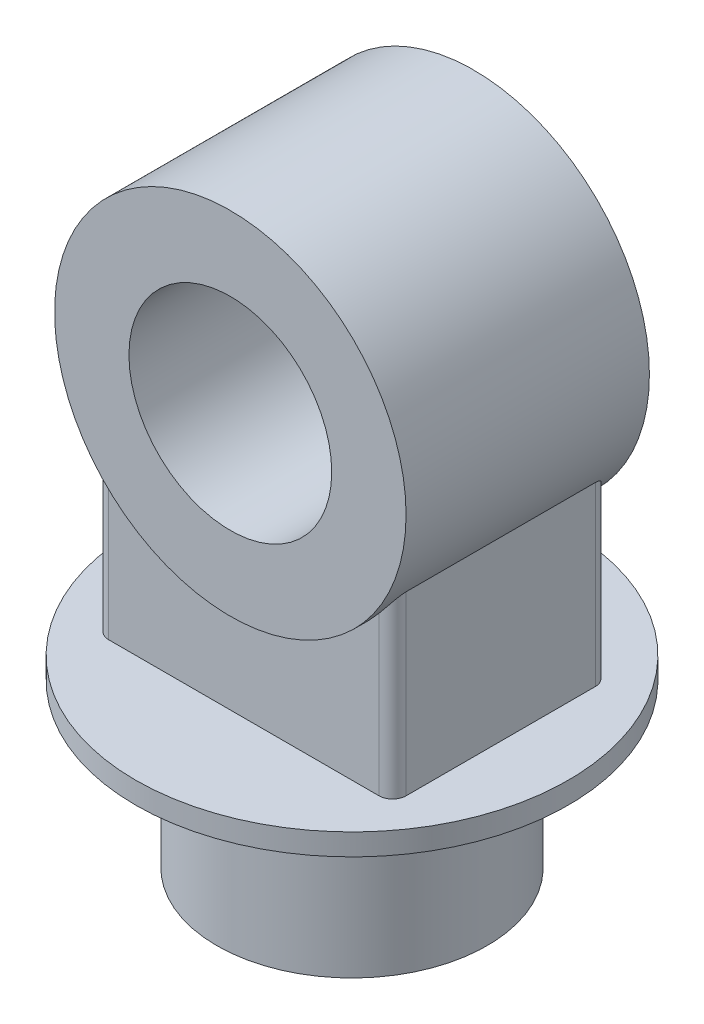
ISO-10303-21;
HEADER;
FILE_DESCRIPTION(('STEP AP214'),'2;1');
FILE_NAME('part.step','',(''),(''),'','','');
FILE_SCHEMA(('AUTOMOTIVE_DESIGN { 1 0 10303 214 1 1 1 1 }'));
ENDSEC;
DATA;
#1=APPLICATION_CONTEXT('core data for automotive mechanical design processes');
#2=APPLICATION_PROTOCOL_DEFINITION('international standard','automotive_design',2000,#1);
#3=PRODUCT_CONTEXT('',#1,'mechanical');
#4=PRODUCT('Part','Part','',(#3));
#5=PRODUCT_RELATED_PRODUCT_CATEGORY('part','',(#4));
#6=PRODUCT_DEFINITION_FORMATION('','',#4);
#7=PRODUCT_DEFINITION_CONTEXT('part definition',#1,'design');
#8=PRODUCT_DEFINITION('design','',#6,#7);
#9=PRODUCT_DEFINITION_SHAPE('','',#8);
#10=(LENGTH_UNIT() NAMED_UNIT(*) SI_UNIT(.MILLI.,.METRE.));
#11=(NAMED_UNIT(*) PLANE_ANGLE_UNIT() SI_UNIT($,.RADIAN.));
#12=(NAMED_UNIT(*) SI_UNIT($,.STERADIAN.) SOLID_ANGLE_UNIT());
#13=UNCERTAINTY_MEASURE_WITH_UNIT(LENGTH_MEASURE(1.E-05),#10,'distance_accuracy_value','');
#14=(GEOMETRIC_REPRESENTATION_CONTEXT(3) GLOBAL_UNCERTAINTY_ASSIGNED_CONTEXT((#13)) GLOBAL_UNIT_ASSIGNED_CONTEXT((#10,
#11,#12)) REPRESENTATION_CONTEXT('',''));
#15=CARTESIAN_POINT('',(0.,0.,0.));
#16=DIRECTION('',(0.,0.,1.));
#17=DIRECTION('',(1.,0.,0.));
#18=AXIS2_PLACEMENT_3D('',#15,#16,#17);
#19=CARTESIAN_POINT('',(0.,3048.,0.));
#20=DIRECTION('',(0.,-1.,0.));
#21=DIRECTION('',(0.,0.,-1.));
#22=AXIS2_PLACEMENT_3D('',#19,#20,#21);
#23=CYLINDRICAL_SURFACE('',#22,2540.);
#24=CARTESIAN_POINT('',(0.,3048.,0.));
#25=DIRECTION('',(0.,1.,0.));
#26=DIRECTION('',(0.,0.,1.));
#27=AXIS2_PLACEMENT_3D('',#24,#25,#26);
#28=CIRCLE('',#27,2540.);
#29=CARTESIAN_POINT('',(0.,3048.,2540.));
#30=VERTEX_POINT('',#29);
#31=EDGE_CURVE('E139',#30,#30,#28,.T.);
#32=ORIENTED_EDGE('',*,*,#31,.F.);
#33=EDGE_LOOP('',(#32));
#34=FACE_BOUND('',#33,.T.);
#35=CARTESIAN_POINT('',(0.,0.,0.));
#36=DIRECTION('',(0.,1.,0.));
#37=DIRECTION('',(0.,0.,1.));
#38=AXIS2_PLACEMENT_3D('',#35,#36,#37);
#39=CIRCLE('',#38,2540.);
#40=CARTESIAN_POINT('',(0.,0.,2540.));
#41=VERTEX_POINT('',#40);
#42=EDGE_CURVE('E217',#41,#41,#39,.T.);
#43=ORIENTED_EDGE('',*,*,#42,.T.);
#44=EDGE_LOOP('',(#43));
#45=FACE_BOUND('',#44,.T.);
#46=ADVANCED_FACE('F38',(#34,#45),#23,.T.);
#47=CARTESIAN_POINT('',(0.,0.,0.));
#48=DIRECTION('',(0.,1.,0.));
#49=DIRECTION('',(0.,0.,1.));
#50=AXIS2_PLACEMENT_3D('',#47,#48,#49);
#51=PLANE('',#50);
#52=ORIENTED_EDGE('',*,*,#42,.F.);
#53=EDGE_LOOP('',(#52));
#54=FACE_BOUND('',#53,.T.);
#55=ADVANCED_FACE('F225',(#54),#51,.F.);
#56=CARTESIAN_POINT('',(0.,3454.4,0.));
#57=DIRECTION('',(0.,-1.,0.));
#58=DIRECTION('',(0.,0.,-1.));
#59=AXIS2_PLACEMENT_3D('',#56,#57,#58);
#60=CYLINDRICAL_SURFACE('',#59,4064.);
#61=CARTESIAN_POINT('',(0.,3454.4,0.));
#62=DIRECTION('',(0.,1.,0.));
#63=DIRECTION('',(0.,0.,1.));
#64=AXIS2_PLACEMENT_3D('',#61,#62,#63);
#65=CIRCLE('',#64,4064.);
#66=CARTESIAN_POINT('',(0.,3454.4,4064.));
#67=VERTEX_POINT('',#66);
#68=EDGE_CURVE('E214',#67,#67,#65,.T.);
#69=ORIENTED_EDGE('',*,*,#68,.F.);
#70=EDGE_LOOP('',(#69));
#71=FACE_BOUND('',#70,.T.);
#72=CARTESIAN_POINT('',(0.,3048.,0.));
#73=DIRECTION('',(0.,1.,0.));
#74=DIRECTION('',(0.,0.,1.));
#75=AXIS2_PLACEMENT_3D('',#72,#73,#74);
#76=CIRCLE('',#75,4064.);
#77=CARTESIAN_POINT('',(0.,3048.,4064.));
#78=VERTEX_POINT('',#77);
#79=EDGE_CURVE('E131',#78,#78,#76,.T.);
#80=ORIENTED_EDGE('',*,*,#79,.T.);
#81=EDGE_LOOP('',(#80));
#82=FACE_BOUND('',#81,.T.);
#83=ADVANCED_FACE('F227',(#71,#82),#60,.T.);
#84=CARTESIAN_POINT('',(0.,3454.4,0.));
#85=DIRECTION('',(0.,1.,0.));
#86=DIRECTION('',(0.,0.,1.));
#87=AXIS2_PLACEMENT_3D('',#84,#85,#86);
#88=PLANE('',#87);
#89=DIRECTION('',(0.,0.,1.));
#90=VECTOR('',#89,1.);
#91=CARTESIAN_POINT('',(-2794.,3454.4,2032.));
#92=LINE('',#91,#90);
#93=CARTESIAN_POINT('',(-2794.,3454.4,-1778.));
#94=VERTEX_POINT('',#93);
#95=CARTESIAN_POINT('',(-2794.,3454.4,1778.));
#96=VERTEX_POINT('',#95);
#97=EDGE_CURVE('E191',#94,#96,#92,.T.);
#98=ORIENTED_EDGE('',*,*,#97,.F.);
#99=CARTESIAN_POINT('',(-2540.,3454.4,-1778.));
#100=DIRECTION('',(0.,1.,0.));
#101=DIRECTION('',(0.,0.,1.));
#102=AXIS2_PLACEMENT_3D('',#99,#100,#101);
#103=CIRCLE('',#102,254.);
#104=CARTESIAN_POINT('',(-2540.,3454.4,-2032.));
#105=VERTEX_POINT('',#104);
#106=EDGE_CURVE('E120',#94,#105,#103,.F.);
#107=ORIENTED_EDGE('',*,*,#106,.T.);
#108=DIRECTION('',(-1.,0.,0.));
#109=VECTOR('',#108,1.);
#110=CARTESIAN_POINT('',(2794.,3454.4,-2032.));
#111=LINE('',#110,#109);
#112=CARTESIAN_POINT('',(2540.,3454.4,-2032.));
#113=VERTEX_POINT('',#112);
#114=EDGE_CURVE('E198',#113,#105,#111,.T.);
#115=ORIENTED_EDGE('',*,*,#114,.F.);
#116=CARTESIAN_POINT('',(2540.,3454.4,-1778.));
#117=DIRECTION('',(0.,1.,0.));
#118=DIRECTION('',(0.,0.,1.));
#119=AXIS2_PLACEMENT_3D('',#116,#117,#118);
#120=CIRCLE('',#119,254.);
#121=CARTESIAN_POINT('',(2794.,3454.4,-1778.));
#122=VERTEX_POINT('',#121);
#123=EDGE_CURVE('E121',#113,#122,#120,.F.);
#124=ORIENTED_EDGE('',*,*,#123,.T.);
#125=DIRECTION('',(0.,0.,-1.));
#126=VECTOR('',#125,1.);
#127=CARTESIAN_POINT('',(2794.,3454.4,2032.));
#128=LINE('',#127,#126);
#129=CARTESIAN_POINT('',(2794.,3454.4,1778.));
#130=VERTEX_POINT('',#129);
#131=EDGE_CURVE('E387',#130,#122,#128,.T.);
#132=ORIENTED_EDGE('',*,*,#131,.F.);
#133=CARTESIAN_POINT('',(2540.,3454.4,1778.));
#134=DIRECTION('',(0.,1.,0.));
#135=DIRECTION('',(0.,0.,1.));
#136=AXIS2_PLACEMENT_3D('',#133,#134,#135);
#137=CIRCLE('',#136,254.);
#138=CARTESIAN_POINT('',(2540.,3454.4,2032.));
#139=VERTEX_POINT('',#138);
#140=EDGE_CURVE('E59',#130,#139,#137,.F.);
#141=ORIENTED_EDGE('',*,*,#140,.T.);
#142=DIRECTION('',(1.,0.,0.));
#143=VECTOR('',#142,1.);
#144=CARTESIAN_POINT('',(2794.,3454.4,2032.));
#145=LINE('',#144,#143);
#146=CARTESIAN_POINT('',(-2540.,3454.4,2032.));
#147=VERTEX_POINT('',#146);
#148=EDGE_CURVE('E192',#147,#139,#145,.T.);
#149=ORIENTED_EDGE('',*,*,#148,.F.);
#150=CARTESIAN_POINT('',(-2540.,3454.4,1778.));
#151=DIRECTION('',(0.,1.,0.));
#152=DIRECTION('',(0.,0.,1.));
#153=AXIS2_PLACEMENT_3D('',#150,#151,#152);
#154=CIRCLE('',#153,254.);
#155=EDGE_CURVE('E52',#147,#96,#154,.F.);
#156=ORIENTED_EDGE('',*,*,#155,.T.);
#157=EDGE_LOOP('',(#98,#107,#115,#124,#132,#141,#149,#156));
#158=FACE_BOUND('',#157,.T.);
#159=ORIENTED_EDGE('',*,*,#68,.T.);
#160=EDGE_LOOP('',(#159));
#161=FACE_BOUND('',#160,.T.);
#162=ADVANCED_FACE('F189',(#158,#161),#88,.T.);
#163=CARTESIAN_POINT('',(0.,3048.,0.));
#164=DIRECTION('',(0.,1.,0.));
#165=DIRECTION('',(0.,0.,1.));
#166=AXIS2_PLACEMENT_3D('',#163,#164,#165);
#167=PLANE('',#166);
#168=ORIENTED_EDGE('',*,*,#31,.T.);
#169=EDGE_LOOP('',(#168));
#170=FACE_BOUND('',#169,.T.);
#171=ORIENTED_EDGE('',*,*,#79,.F.);
#172=EDGE_LOOP('',(#171));
#173=FACE_BOUND('',#172,.T.);
#174=ADVANCED_FACE('F236',(#170,#173),#167,.F.);
#175=CARTESIAN_POINT('',(2794.,11836.402,2032.));
#176=DIRECTION('',(0.,0.,-1.));
#177=DIRECTION('',(-1.,0.,0.));
#178=AXIS2_PLACEMENT_3D('',#175,#176,#177);
#179=PLANE('',#178);
#180=ORIENTED_EDGE('',*,*,#148,.T.);
#181=DIRECTION('',(0.,-1.,0.));
#182=VECTOR('',#181,1.);
#183=CARTESIAN_POINT('',(2540.,11836.402,2032.));
#184=LINE('',#183,#182);
#185=CARTESIAN_POINT('',(2540.,6424.51753881881,2032.));
#186=VERTEX_POINT('',#185);
#187=EDGE_CURVE('E151',#139,#186,#184,.F.);
#188=ORIENTED_EDGE('',*,*,#187,.T.);
#189=CARTESIAN_POINT('',(0.,8534.4,2032.));
#190=DIRECTION('',(0.,0.,-1.));
#191=DIRECTION('',(-1.,0.,0.));
#192=AXIS2_PLACEMENT_3D('',#189,#190,#191);
#193=CIRCLE('',#192,3302.);
#194=CARTESIAN_POINT('',(-2540.,6424.51753881881,2032.));
#195=VERTEX_POINT('',#194);
#196=EDGE_CURVE('E204',#195,#186,#193,.F.);
#197=ORIENTED_EDGE('',*,*,#196,.F.);
#198=DIRECTION('',(0.,-1.,0.));
#199=VECTOR('',#198,1.);
#200=CARTESIAN_POINT('',(-2540.,11836.402,2032.));
#201=LINE('',#200,#199);
#202=EDGE_CURVE('E149',#195,#147,#201,.T.);
#203=ORIENTED_EDGE('',*,*,#202,.T.);
#204=EDGE_LOOP('',(#180,#188,#197,#203));
#205=FACE_BOUND('',#204,.T.);
#206=ADVANCED_FACE('F208',(#205),#179,.F.);
#207=CARTESIAN_POINT('',(-2794.,11836.402,2032.));
#208=DIRECTION('',(1.,0.,0.));
#209=DIRECTION('',(0.,0.,-1.));
#210=AXIS2_PLACEMENT_3D('',#207,#208,#209);
#211=PLANE('',#210);
#212=DIRECTION('',(0.,0.,-1.));
#213=VECTOR('',#212,1.);
#214=CARTESIAN_POINT('',(-2794.,6774.63637951002,2286.));
#215=LINE('',#214,#213);
#216=CARTESIAN_POINT('',(-2794.,6774.63637951002,-1778.));
#217=VERTEX_POINT('',#216);
#218=CARTESIAN_POINT('',(-2794.,6774.63637951002,1778.));
#219=VERTEX_POINT('',#218);
#220=EDGE_CURVE('E206',#217,#219,#215,.F.);
#221=ORIENTED_EDGE('',*,*,#220,.F.);
#222=DIRECTION('',(0.,-1.,0.));
#223=VECTOR('',#222,1.);
#224=CARTESIAN_POINT('',(-2794.,11836.402,-1778.));
#225=LINE('',#224,#223);
#226=EDGE_CURVE('E146',#217,#94,#225,.T.);
#227=ORIENTED_EDGE('',*,*,#226,.T.);
#228=ORIENTED_EDGE('',*,*,#97,.T.);
#229=DIRECTION('',(0.,-1.,0.));
#230=VECTOR('',#229,1.);
#231=CARTESIAN_POINT('',(-2794.,11836.402,1778.));
#232=LINE('',#231,#230);
#233=EDGE_CURVE('E144',#96,#219,#232,.F.);
#234=ORIENTED_EDGE('',*,*,#233,.T.);
#235=EDGE_LOOP('',(#221,#227,#228,#234));
#236=FACE_BOUND('',#235,.T.);
#237=ADVANCED_FACE('F195',(#236),#211,.F.);
#238=CARTESIAN_POINT('',(2794.,11836.402,2032.));
#239=DIRECTION('',(-1.,0.,0.));
#240=DIRECTION('',(0.,0.,1.));
#241=AXIS2_PLACEMENT_3D('',#238,#239,#240);
#242=PLANE('',#241);
#243=ORIENTED_EDGE('',*,*,#131,.T.);
#244=DIRECTION('',(0.,-1.,0.));
#245=VECTOR('',#244,1.);
#246=CARTESIAN_POINT('',(2794.,11836.402,-1778.));
#247=LINE('',#246,#245);
#248=CARTESIAN_POINT('',(2794.,6774.63637951002,-1778.));
#249=VERTEX_POINT('',#248);
#250=EDGE_CURVE('E137',#122,#249,#247,.F.);
#251=ORIENTED_EDGE('',*,*,#250,.T.);
#252=DIRECTION('',(0.,0.,-1.));
#253=VECTOR('',#252,1.);
#254=CARTESIAN_POINT('',(2794.,6774.63637951002,2286.));
#255=LINE('',#254,#253);
#256=CARTESIAN_POINT('',(2794.,6774.63637951002,1778.));
#257=VERTEX_POINT('',#256);
#258=EDGE_CURVE('E116',#257,#249,#255,.T.);
#259=ORIENTED_EDGE('',*,*,#258,.F.);
#260=DIRECTION('',(0.,-1.,0.));
#261=VECTOR('',#260,1.);
#262=CARTESIAN_POINT('',(2794.,11836.402,1778.));
#263=LINE('',#262,#261);
#264=EDGE_CURVE('E134',#257,#130,#263,.T.);
#265=ORIENTED_EDGE('',*,*,#264,.T.);
#266=EDGE_LOOP('',(#243,#251,#259,#265));
#267=FACE_BOUND('',#266,.T.);
#268=ADVANCED_FACE('F244',(#267),#242,.F.);
#269=CARTESIAN_POINT('',(2794.,11836.402,-2032.));
#270=DIRECTION('',(0.,0.,1.));
#271=DIRECTION('',(1.,0.,0.));
#272=AXIS2_PLACEMENT_3D('',#269,#270,#271);
#273=PLANE('',#272);
#274=CARTESIAN_POINT('',(0.,8534.4,-2032.));
#275=DIRECTION('',(0.,0.,1.));
#276=DIRECTION('',(1.,0.,0.));
#277=AXIS2_PLACEMENT_3D('',#274,#275,#276);
#278=CIRCLE('',#277,3302.);
#279=CARTESIAN_POINT('',(2540.,6424.51753881881,-2032.));
#280=VERTEX_POINT('',#279);
#281=CARTESIAN_POINT('',(-2540.,6424.51753881881,-2032.));
#282=VERTEX_POINT('',#281);
#283=EDGE_CURVE('E113',#280,#282,#278,.F.);
#284=ORIENTED_EDGE('',*,*,#283,.F.);
#285=DIRECTION('',(0.,-1.,0.));
#286=VECTOR('',#285,1.);
#287=CARTESIAN_POINT('',(2540.,11836.402,-2032.));
#288=LINE('',#287,#286);
#289=EDGE_CURVE('E127',#280,#113,#288,.T.);
#290=ORIENTED_EDGE('',*,*,#289,.T.);
#291=ORIENTED_EDGE('',*,*,#114,.T.);
#292=DIRECTION('',(0.,-1.,0.));
#293=VECTOR('',#292,1.);
#294=CARTESIAN_POINT('',(-2540.,11836.402,-2032.));
#295=LINE('',#294,#293);
#296=EDGE_CURVE('E130',#105,#282,#295,.F.);
#297=ORIENTED_EDGE('',*,*,#296,.T.);
#298=EDGE_LOOP('',(#284,#290,#291,#297));
#299=FACE_BOUND('',#298,.T.);
#300=ADVANCED_FACE('F125',(#299),#273,.F.);
#301=CARTESIAN_POINT('',(0.,8534.4,2286.));
#302=DIRECTION('',(0.,0.,-1.));
#303=DIRECTION('',(-1.,0.,0.));
#304=AXIS2_PLACEMENT_3D('',#301,#302,#303);
#305=CYLINDRICAL_SURFACE('',#304,3302.);
#306=CARTESIAN_POINT('',(0.,8534.4,2286.));
#307=DIRECTION('',(0.,0.,1.));
#308=DIRECTION('',(1.,0.,0.));
#309=AXIS2_PLACEMENT_3D('',#306,#307,#308);
#310=CIRCLE('',#309,3302.);
#311=CARTESIAN_POINT('',(3302.,8534.4,2286.));
#312=VERTEX_POINT('',#311);
#313=EDGE_CURVE('E199',#312,#312,#310,.T.);
#314=ORIENTED_EDGE('',*,*,#313,.F.);
#315=EDGE_LOOP('',(#314));
#316=FACE_BOUND('',#315,.T.);
#317=CARTESIAN_POINT('',(0.,8534.4,-2286.));
#318=DIRECTION('',(0.,0.,1.));
#319=DIRECTION('',(1.,0.,0.));
#320=AXIS2_PLACEMENT_3D('',#317,#318,#319);
#321=CIRCLE('',#320,3302.);
#322=CARTESIAN_POINT('',(3302.,8534.4,-2286.));
#323=VERTEX_POINT('',#322);
#324=EDGE_CURVE('E392',#323,#323,#321,.T.);
#325=ORIENTED_EDGE('',*,*,#324,.T.);
#326=EDGE_LOOP('',(#325));
#327=FACE_BOUND('',#326,.T.);
#328=ORIENTED_EDGE('',*,*,#283,.T.);
#329=CARTESIAN_POINT('',(-2540.,6424.51753881881,-2032.));
#330=CARTESIAN_POINT('',(-2542.83977860557,6427.93622161435,-2031.9999734893));
#331=CARTESIAN_POINT('',(-2545.67262886829,6431.36062344505,-2031.95237538715));
#332=CARTESIAN_POINT('',(-2551.32318321051,6438.2192475725,-2031.76323632053));
#333=CARTESIAN_POINT('',(-2554.14088748035,6441.65346974502,-2031.62169653936));
#334=CARTESIAN_POINT('',(-2559.75979933091,6448.53004086149,-2031.2458832437));
#335=CARTESIAN_POINT('',(-2562.56100768401,6451.97238941422,-2031.01161410658));
#336=CARTESIAN_POINT('',(-2568.14589800616,6458.86384836957,-2030.45135161428));
#337=CARTESIAN_POINT('',(-2570.92957990912,6462.31295879762,-2030.12535791346));
#338=CARTESIAN_POINT('',(-2576.48087919177,6469.21963800539,-2029.38216934964));
#339=CARTESIAN_POINT('',(-2579.24847905792,6472.67721168396,-2028.96488924465));
#340=CARTESIAN_POINT('',(-2584.76388850416,6479.59606452742,-2028.04002300334));
#341=CARTESIAN_POINT('',(-2587.51169806634,6483.05734369566,-2027.53243678525));
#342=CARTESIAN_POINT('',(-2592.98649763878,6489.98211102144,-2026.42751407468));
#343=CARTESIAN_POINT('',(-2595.71348738783,6493.44559920609,-2025.8301764581));
#344=CARTESIAN_POINT('',(-2601.14557385789,6500.37318641411,-2024.5461577295));
#345=CARTESIAN_POINT('',(-2603.85067055837,6503.83728543803,-2023.85947653378));
#346=CARTESIAN_POINT('',(-2609.26591476256,6510.80047435419,-2022.38941490154));
#347=CARTESIAN_POINT('',(-2611.97582296525,6514.29955401973,-2021.60510427863));
#348=CARTESIAN_POINT('',(-2617.37117316368,6521.29502174544,-2019.94558797426));
#349=CARTESIAN_POINT('',(-2620.05661516282,6524.79140980597,-2019.07038230541));
#350=CARTESIAN_POINT('',(-2625.40202527443,6531.77982659366,-2017.22893926882));
#351=CARTESIAN_POINT('',(-2628.06199278137,6535.27185521549,-2016.2626997431));
#352=CARTESIAN_POINT('',(-2633.35530016709,6542.24964417058,-2014.23889753478));
#353=CARTESIAN_POINT('',(-2635.98863999183,6545.73540449111,-2013.18133466691));
#354=CARTESIAN_POINT('',(-2641.22624406055,6552.69697178174,-2010.97493145605));
#355=CARTESIAN_POINT('',(-2643.83052222256,6556.1727828665,-2009.82613715091));
#356=CARTESIAN_POINT('',(-2649.01014681255,6563.11412661108,-2007.43609803065));
#357=CARTESIAN_POINT('',(-2651.58549346622,6566.57965935093,-2006.19485393725));
#358=CARTESIAN_POINT('',(-2656.70581227357,6573.49797664729,-2003.61907238506));
#359=CARTESIAN_POINT('',(-2659.25078710741,6576.95076230982,-2002.28454323056));
#360=CARTESIAN_POINT('',(-2664.30926376633,6583.84151191211,-1999.52090942607));
#361=CARTESIAN_POINT('',(-2666.82276550256,6587.27947581002,-1998.09180450918));
#362=CARTESIAN_POINT('',(-2672.42939284742,6594.97919920993,-1994.7752522514));
#363=CARTESIAN_POINT('',(-2675.51347601726,6599.23619069841,-1992.86135887939));
#364=CARTESIAN_POINT('',(-2681.62749276398,6607.71753574206,-1988.88138436238));
#365=CARTESIAN_POINT('',(-2684.65742844154,6611.94189055976,-1986.81530913733));
#366=CARTESIAN_POINT('',(-2690.66001770349,6620.35210095168,-1982.5266872802));
#367=CARTESIAN_POINT('',(-2693.63266895241,6624.53795495261,-1980.30413428572));
#368=CARTESIAN_POINT('',(-2699.51669088708,6632.86387869651,-1975.6977137502));
#369=CARTESIAN_POINT('',(-2702.42806123731,6637.00394818874,-1973.31384532623));
#370=CARTESIAN_POINT('',(-2708.17703457426,6645.21863977067,-1968.38587042588));
#371=CARTESIAN_POINT('',(-2711.01481966652,6649.29341146343,-1965.84222642692));
#372=CARTESIAN_POINT('',(-2716.61983468486,6657.37978858899,-1960.58205341184));
#373=CARTESIAN_POINT('',(-2719.38706292178,6661.39139250864,-1957.8655202621));
#374=CARTESIAN_POINT('',(-2724.84380189956,6669.33874584763,-1952.25293041896));
#375=CARTESIAN_POINT('',(-2727.53333823711,6673.27452010444,-1949.35693386455));
#376=CARTESIAN_POINT('',(-2732.82817451339,6681.05806853299,-1943.37607553343));
#377=CARTESIAN_POINT('',(-2735.43348225661,6684.90585084821,-1940.29123133213));
#378=CARTESIAN_POINT('',(-2739.59611244767,6691.08087918665,-1935.11125140864));
#379=CARTESIAN_POINT('',(-2741.18172278654,6693.43974099827,-1933.07634598778));
#380=CARTESIAN_POINT('',(-2744.31380948043,6698.11199902808,-1928.92589797701));
#381=CARTESIAN_POINT('',(-2745.86028747485,6700.42539715002,-1926.81035877451));
#382=CARTESIAN_POINT('',(-2748.9113713213,6705.00178293512,-1922.49574593458));
#383=CARTESIAN_POINT('',(-2750.41597436698,6707.26476721766,-1920.29666672176));
#384=CARTESIAN_POINT('',(-2753.37994525516,6711.73435120665,-1915.81227371327));
#385=CARTESIAN_POINT('',(-2754.83931292045,6713.9409506922,-1913.52695957984));
#386=CARTESIAN_POINT('',(-2757.70866421257,6718.29050192588,-1908.86794930323));
#387=CARTESIAN_POINT('',(-2759.11866259583,6720.43347266295,-1906.49428001457));
#388=CARTESIAN_POINT('',(-2761.8855537627,6724.64903794148,-1901.65504311363));
#389=CARTESIAN_POINT('',(-2763.24244554673,6726.72163115819,-1899.18947377327));
#390=CARTESIAN_POINT('',(-2765.89799144176,6730.78746003102,-1894.16441362361));
#391=CARTESIAN_POINT('',(-2767.19666069295,6732.78071630263,-1891.60494754971));
#392=CARTESIAN_POINT('',(-2769.73059696136,6736.67871305885,-1886.38937943326));
#393=CARTESIAN_POINT('',(-2770.96586878652,6738.58346025479,-1883.73328474504));
#394=CARTESIAN_POINT('',(-2773.87166230378,6743.07371981701,-1877.1852796379));
#395=CARTESIAN_POINT('',(-2775.50702168491,6745.60905649436,-1873.24296962534));
#396=CARTESIAN_POINT('',(-2778.61817497287,6750.44559855717,-1865.15576363628));
#397=CARTESIAN_POINT('',(-2780.09397924302,6752.74681914818,-1861.01088084258));
#398=CARTESIAN_POINT('',(-2782.16790082376,6755.98851413022,-1854.65281448186));
#399=CARTESIAN_POINT('',(-2782.83479269946,6757.03229884737,-1852.5141337591));
#400=CARTESIAN_POINT('',(-2784.12022732024,6759.04651802023,-1848.18834886601));
#401=CARTESIAN_POINT('',(-2784.738775148,6760.0169601865,-1846.00124981728));
#402=CARTESIAN_POINT('',(-2785.92442375123,6761.87910476924,-1841.57999978288));
#403=CARTESIAN_POINT('',(-2786.49152353764,6762.77080567192,-1839.34584789365));
#404=CARTESIAN_POINT('',(-2787.57105773969,6764.46988520958,-1834.83268561231));
#405=CARTESIAN_POINT('',(-2788.08349366066,6765.27726616652,-1832.55367645752));
#406=CARTESIAN_POINT('',(-2789.00083023081,6766.7238347182,-1828.18997813993));
#407=CARTESIAN_POINT('',(-2789.41136999525,6767.37178014488,-1826.10937609511));
#408=CARTESIAN_POINT('',(-2790.18361669496,6768.59142989419,-1821.91697488124));
#409=CARTESIAN_POINT('',(-2790.5453245395,6769.16313563644,-1819.80517629389));
#410=CARTESIAN_POINT('',(-2791.21767452149,6770.22645718312,-1815.55408765038));
#411=CARTESIAN_POINT('',(-2791.52833122583,6770.71809583344,-1813.41480562482));
#412=CARTESIAN_POINT('',(-2792.09673285078,6771.618074235,-1809.11184192219));
#413=CARTESIAN_POINT('',(-2792.35447894374,6772.02641583182,-1806.94816078685));
#414=CARTESIAN_POINT('',(-2792.81823440346,6772.76141589791,-1802.5731474505));
#415=CARTESIAN_POINT('',(-2793.02355301945,6773.08698357203,-1800.36155811253));
#416=CARTESIAN_POINT('',(-2793.37669027031,6773.64709970057,-1795.92235426052));
#417=CARTESIAN_POINT('',(-2793.52450975042,6773.88164949295,-1793.69473998253));
#418=CARTESIAN_POINT('',(-2793.7617057171,6774.25807913071,-1789.22543095468));
#419=CARTESIAN_POINT('',(-2793.8510029289,6774.399833274,-1786.98372124131));
#420=CARTESIAN_POINT('',(-2793.94036625205,6774.54170102293,-1783.61708634609));
#421=CARTESIAN_POINT('',(-2793.96272361549,6774.57719636991,-1782.49410431326));
#422=CARTESIAN_POINT('',(-2793.99254184018,6774.62453802274,-1780.24743081371));
#423=CARTESIAN_POINT('',(-2794.00000252148,6774.63638404291,-1779.12373933859));
#424=CARTESIAN_POINT('',(-2794.,6774.63637951002,-1778.));
#425=B_SPLINE_CURVE_WITH_KNOTS('',3,(#329,#330,#331,#332,#333,#334,#335,#336,#337,#338,#339,
#340,#341,#342,#343,#344,#345,#346,#347,#348,#349,#350,#351,#352,#353,#354,#355,#356,#357,#358,
#359,#360,#361,#362,#363,#364,#365,#366,#367,#368,#369,#370,#371,#372,#373,#374,#375,#376,#377,
#378,#379,#380,#381,#382,#383,#384,#385,#386,#387,#388,#389,#390,#391,#392,#393,#394,#395,#396,
#397,#398,#399,#400,#401,#402,#403,#404,#405,#406,#407,#408,#409,#410,#411,#412,#413,#414,#415,
#416,#417,#418,#419,#420,#421,#422,#423,#424),.UNSPECIFIED.,.F.,.F.,(4,2,2,2,2,2,2,2,2,2,2,2,2,
2,2,2,2,2,2,2,2,2,2,2,2,2,2,2,2,2,2,2,2,2,2,2,2,2,2,2,2,2,2,2,2,2,2,4),(0.,13.3325731309086,
26.6649783266545,39.9967542281349,53.328580368406,66.6729091320808,80.0172499763155,
93.3617579654746,106.706278456228,120.189385373506,133.672490420766,147.155915169038,
160.639367271431,174.116057973201,187.592643475092,201.068030805628,214.543456166552,
231.324022303991,248.103936015558,264.884532396287,281.665220628519,298.399394733674,
315.13396908823,331.862965623321,348.590407606825,359.075960416877,369.561073217003,
380.04688701874,390.532741893907,401.015435329468,411.498325979354,421.978474656348,
432.457827360742,447.339644037476,462.220493540058,469.633233914452,477.045193896404,
484.45729634197,491.869194622673,498.519717435845,505.17011639461,511.818614428611,
518.466965137212,525.198850780706,531.930637462341,538.671524335319,542.042519234386,
545.41355485247),.UNSPECIFIED.);
#426=EDGE_CURVE('E175',#282,#217,#425,.T.);
#427=ORIENTED_EDGE('',*,*,#426,.T.);
#428=ORIENTED_EDGE('',*,*,#220,.T.);
#429=CARTESIAN_POINT('',(-2794.,6774.63637951002,1778.));
#430=CARTESIAN_POINT('',(-2794.00000174196,6774.63638264188,1779.02497469673));
#431=CARTESIAN_POINT('',(-2793.99379531502,6774.62652820204,1780.04991307944));
#432=CARTESIAN_POINT('',(-2793.96898653863,6774.58713976709,1782.09925365362));
#433=CARTESIAN_POINT('',(-2793.95038428594,6774.55760592558,1783.12365584922));
#434=CARTESIAN_POINT('',(-2793.87602052908,6774.43954839144,1786.19512814832));
#435=CARTESIAN_POINT('',(-2793.80170201586,6774.32156867143,1788.24072314059));
#436=CARTESIAN_POINT('',(-2793.60415589371,6774.00803960556,1792.3213484798));
#437=CARTESIAN_POINT('',(-2793.4809793328,6773.81257122178,1794.35638761458));
#438=CARTESIAN_POINT('',(-2793.18648779539,6773.3453953325,1798.41422230554));
#439=CARTESIAN_POINT('',(-2793.01517225589,6773.07368693534,1800.43701771824));
#440=CARTESIAN_POINT('',(-2792.62751614018,6772.4591137757,1804.44520941196));
#441=CARTESIAN_POINT('',(-2792.41167301453,6772.11703527968,1806.43077473624));
#442=CARTESIAN_POINT('',(-2791.93509518367,6771.36210378946,1810.38318260995));
#443=CARTESIAN_POINT('',(-2791.67435540532,6770.94924279711,1812.350023017));
#444=CARTESIAN_POINT('',(-2791.10935827596,6770.05512731515,1816.26221601373));
#445=CARTESIAN_POINT('',(-2790.8050915588,6769.57385810557,1818.20756388133));
#446=CARTESIAN_POINT('',(-2790.15464273529,6768.54569130307,1822.0737781585));
#447=CARTESIAN_POINT('',(-2789.80845896915,6767.9987911114,1823.99464359532));
#448=CARTESIAN_POINT('',(-2788.98756133025,6766.70288100536,1828.26931069734));
#449=CARTESIAN_POINT('',(-2788.50197668463,6765.936924404,1830.61590628665));
#450=CARTESIAN_POINT('',(-2787.47213896295,6764.31412699742,1835.26437678415));
#451=CARTESIAN_POINT('',(-2786.92788265238,6763.4572811816,1837.56624921853));
#452=CARTESIAN_POINT('',(-2785.78403886701,6761.65850041581,1842.12272519984));
#453=CARTESIAN_POINT('',(-2785.18444647286,6760.71655790092,1844.3773245223));
#454=CARTESIAN_POINT('',(-2783.93331193687,6758.75344997865,1848.83717328533));
#455=CARTESIAN_POINT('',(-2783.2817639944,6757.73227572572,1851.04241718028));
#456=CARTESIAN_POINT('',(-2781.24880267458,6754.55016280933,1857.5990409809));
#457=CARTESIAN_POINT('',(-2779.79346674321,6752.27755379692,1861.87397358445));
#458=CARTESIAN_POINT('',(-2776.71164258883,6747.47958151699,1870.21373405539));
#459=CARTESIAN_POINT('',(-2775.08514410281,6744.95420309372,1874.27854930221));
#460=CARTESIAN_POINT('',(-2772.07222516912,6740.29146751183,1881.29341047258));
#461=CARTESIAN_POINT('',(-2770.71606582389,6738.19760124299,1884.28565876981));
#462=CARTESIAN_POINT('',(-2767.92330444797,6733.8969721097,1890.14952163145));
#463=CARTESIAN_POINT('',(-2766.48669269039,6731.6901955969,1893.02112153537));
#464=CARTESIAN_POINT('',(-2763.54020191772,6727.17648854903,1898.64770145901));
#465=CARTESIAN_POINT('',(-2762.03029069471,6724.8695140345,1901.40262919879));
#466=CARTESIAN_POINT('',(-2758.9444822459,6720.16813772115,1906.79818291332));
#467=CARTESIAN_POINT('',(-2757.36858703324,6717.77373858987,1909.43881237023));
#468=CARTESIAN_POINT('',(-2754.15426526213,6712.90423917882,1914.61347351019));
#469=CARTESIAN_POINT('',(-2752.51575266154,6710.42902859016,1917.14734766375));
#470=CARTESIAN_POINT('',(-2749.1833665016,6705.41014460105,1922.10846056806));
#471=CARTESIAN_POINT('',(-2747.48949315198,6702.86647145994,1924.53569972269));
#472=CARTESIAN_POINT('',(-2744.05100156406,6697.71884086233,1929.28710197205));
#473=CARTESIAN_POINT('',(-2742.30639038596,6695.11489180344,1931.61127929533));
#474=CARTESIAN_POINT('',(-2738.76989957099,6689.8530404074,1936.1607682561));
#475=CARTESIAN_POINT('',(-2736.97801727887,6687.19513504139,1938.38607432095));
#476=CARTESIAN_POINT('',(-2733.61263609546,6682.21922383177,1942.42634774005));
#477=CARTESIAN_POINT('',(-2732.04501310431,6679.90762504794,1944.25413060125));
#478=CARTESIAN_POINT('',(-2728.87955782605,6675.25280835313,1947.84179508297));
#479=CARTESIAN_POINT('',(-2727.28172650891,6672.90959145808,1949.60167887818));
#480=CARTESIAN_POINT('',(-2724.05722829755,6668.19412265563,1953.05576103033));
#481=CARTESIAN_POINT('',(-2722.43055729003,6665.82186662168,1954.74994990585));
#482=CARTESIAN_POINT('',(-2719.15006349849,6661.05131054242,1958.0741729757));
#483=CARTESIAN_POINT('',(-2717.49624048545,6658.6530102775,1959.70420662853));
#484=CARTESIAN_POINT('',(-2714.1618641333,6653.83147654578,1962.90263653937));
#485=CARTESIAN_POINT('',(-2712.48129652358,6651.40823002927,1964.47099822743));
#486=CARTESIAN_POINT('',(-2709.09553255246,6646.54031619722,1967.54664742016));
#487=CARTESIAN_POINT('',(-2707.39033625005,6644.09564893299,1969.05393507109));
#488=CARTESIAN_POINT('',(-2703.95649437307,6639.18701803243,1972.00875831289));
#489=CARTESIAN_POINT('',(-2702.22785016726,6636.72305552597,1973.45629737179));
#490=CARTESIAN_POINT('',(-2698.74799473771,6631.77749275273,1976.2929972149));
#491=CARTESIAN_POINT('',(-2696.99678299418,6629.29589208028,1977.68215665131));
#492=CARTESIAN_POINT('',(-2691.70215025174,6621.81512290853,1981.770414619));
#493=CARTESIAN_POINT('',(-2688.12594121955,6616.79172642249,1984.38324681021));
#494=CARTESIAN_POINT('',(-2680.89314443601,6606.69293438015,1989.38698684325));
#495=CARTESIAN_POINT('',(-2677.236556215,6601.61753852011,1991.77789338794));
#496=CARTESIAN_POINT('',(-2669.84918636412,6591.4257532344,1996.34385578948));
#497=CARTESIAN_POINT('',(-2666.11842077061,6586.30937280895,1998.51895770488));
#498=CARTESIAN_POINT('',(-2658.58678822939,6576.0433362055,2002.6589400936));
#499=CARTESIAN_POINT('',(-2654.78592053195,6570.89367967201,2004.62381831713));
#500=CARTESIAN_POINT('',(-2646.58812802051,6559.85477332083,2008.6046567198));
#501=CARTESIAN_POINT('',(-2642.18146656641,6553.96173358412,2010.59010030168));
#502=CARTESIAN_POINT('',(-2633.28867851362,6542.1526825357,2014.2973300933));
#503=CARTESIAN_POINT('',(-2628.80255037975,6536.23667078192,2016.01911120326));
#504=CARTESIAN_POINT('',(-2619.75573130556,6524.39018378718,2019.20119896269));
#505=CARTESIAN_POINT('',(-2615.19503127795,6518.45970685954,2020.66147348204));
#506=CARTESIAN_POINT('',(-2606.00482472903,6506.59350783939,2023.32069900341));
#507=CARTESIAN_POINT('',(-2601.37531840472,6500.65778576193,2024.51965075352));
#508=CARTESIAN_POINT('',(-2592.09799330874,6488.84681357841,2026.64477616783));
#509=CARTESIAN_POINT('',(-2587.45078945451,6482.97153624512,2027.57348688204));
#510=CARTESIAN_POINT('',(-2578.09904246892,6471.23116463606,2029.17118483997));
#511=CARTESIAN_POINT('',(-2573.39450013141,6465.36607022058,2029.84017567529));
#512=CARTESIAN_POINT('',(-2566.29956178754,6456.58270137503,2030.64598852297));
#513=CARTESIAN_POINT('',(-2563.92846688015,6453.65758194597,2030.88163357237));
#514=CARTESIAN_POINT('',(-2559.17399740084,6447.81268062287,2031.28649815157));
#515=CARTESIAN_POINT('',(-2556.7906228582,6444.8928987161,2031.45571783975));
#516=CARTESIAN_POINT('',(-2552.01225802699,6439.05953843777,2031.72708357714));
#517=CARTESIAN_POINT('',(-2549.61726727032,6436.14596032313,2031.82922690043));
#518=CARTESIAN_POINT('',(-2544.81651489251,6430.32606114424,2031.96567848209));
#519=CARTESIAN_POINT('',(-2542.41075318327,6427.41974013967,2031.99998618455));
#520=CARTESIAN_POINT('',(-2540.,6424.51753881881,2032.));
#521=B_SPLINE_CURVE_WITH_KNOTS('',3,(#429,#430,#431,#432,#433,#434,#435,#436,#437,#438,#439,
#440,#441,#442,#443,#444,#445,#446,#447,#448,#449,#450,#451,#452,#453,#454,#455,#456,#457,#458,
#459,#460,#461,#462,#463,#464,#465,#466,#467,#468,#469,#470,#471,#472,#473,#474,#475,#476,#477,
#478,#479,#480,#481,#482,#483,#484,#485,#486,#487,#488,#489,#490,#491,#492,#493,#494,#495,#496,
#497,#498,#499,#500,#501,#502,#503,#504,#505,#506,#507,#508,#509,#510,#511,#512,#513,#514,#515,
#516,#517,#518,#519,#520),.UNSPECIFIED.,.F.,.F.,(4,2,2,2,2,2,2,2,2,2,2,2,2,2,2,2,2,2,2,2,2,2,2,
2,2,2,2,2,2,2,2,2,2,2,2,2,2,2,2,2,2,2,2,2,2,4),(0.,3.07478563664831,6.14954727233712,
12.2982937397524,18.4406327054807,24.5830435118246,30.6602265948872,36.7380968274509,
42.8172768713667,48.8966977085489,56.4409866155735,63.9856916462398,71.531068045382,
79.0772880374425,94.2270890453292,109.377798962322,121.060684483591,132.74498555841,
144.434468050097,156.123594163573,167.829404477559,179.535170451806,191.239315282871,
202.944118954385,212.956900554087,222.969361192934,232.98326154318,242.997246399632,
253.016766776403,263.036263156723,273.055177148304,283.074322319118,303.160473090195,
323.246741255271,343.328713203352,363.410900044787,386.270421599319,409.130385250053,
431.993155677036,454.855860653755,477.496438924227,500.136704093644,511.454576500168,
522.772421919116,534.090727254507,545.409125343037),.UNSPECIFIED.);
#522=EDGE_CURVE('E11',#219,#195,#521,.T.);
#523=ORIENTED_EDGE('',*,*,#522,.T.);
#524=ORIENTED_EDGE('',*,*,#196,.T.);
#525=CARTESIAN_POINT('',(2540.,6424.51753881881,2032.));
#526=CARTESIAN_POINT('',(2542.83977860557,6427.93622161435,2031.9999734893));
#527=CARTESIAN_POINT('',(2545.67262886829,6431.36062344505,2031.95237538715));
#528=CARTESIAN_POINT('',(2551.32318321051,6438.2192475725,2031.76323632053));
#529=CARTESIAN_POINT('',(2554.14088748035,6441.65346974501,2031.62169653936));
#530=CARTESIAN_POINT('',(2559.75979933091,6448.53004086149,2031.2458832437));
#531=CARTESIAN_POINT('',(2562.56100768401,6451.97238941422,2031.01161410658));
#532=CARTESIAN_POINT('',(2568.14589800616,6458.86384836957,2030.45135161428));
#533=CARTESIAN_POINT('',(2570.92957990912,6462.31295879762,2030.12535791346));
#534=CARTESIAN_POINT('',(2576.48087919177,6469.21963800539,2029.38216934964));
#535=CARTESIAN_POINT('',(2579.24847905792,6472.67721168396,2028.96488924465));
#536=CARTESIAN_POINT('',(2584.76388850416,6479.59606452742,2028.04002300334));
#537=CARTESIAN_POINT('',(2587.51169806634,6483.05734369566,2027.53243678526));
#538=CARTESIAN_POINT('',(2592.98649763878,6489.98211102144,2026.42751407468));
#539=CARTESIAN_POINT('',(2595.71348738783,6493.44559920609,2025.8301764581));
#540=CARTESIAN_POINT('',(2601.14557385789,6500.37318641411,2024.5461577295));
#541=CARTESIAN_POINT('',(2603.85067055837,6503.83728543803,2023.85947653378));
#542=CARTESIAN_POINT('',(2609.26591476256,6510.80047435419,2022.38941490154));
#543=CARTESIAN_POINT('',(2611.97582296525,6514.29955401973,2021.60510427863));
#544=CARTESIAN_POINT('',(2617.37117316369,6521.29502174544,2019.94558797426));
#545=CARTESIAN_POINT('',(2620.05661516282,6524.79140980597,2019.07038230541));
#546=CARTESIAN_POINT('',(2625.40202527443,6531.77982659366,2017.22893926882));
#547=CARTESIAN_POINT('',(2628.06199278137,6535.27185521549,2016.2626997431));
#548=CARTESIAN_POINT('',(2633.35530016709,6542.24964417058,2014.23889753478));
#549=CARTESIAN_POINT('',(2635.98863999184,6545.73540449111,2013.18133466691));
#550=CARTESIAN_POINT('',(2641.22624406055,6552.69697178174,2010.97493145605));
#551=CARTESIAN_POINT('',(2643.83052222256,6556.1727828665,2009.82613715091));
#552=CARTESIAN_POINT('',(2649.01014681255,6563.11412661108,2007.43609803065));
#553=CARTESIAN_POINT('',(2651.58549346622,6566.57965935093,2006.19485393725));
#554=CARTESIAN_POINT('',(2656.70581227357,6573.49797664728,2003.61907238506));
#555=CARTESIAN_POINT('',(2659.25078710741,6576.95076230982,2002.28454323056));
#556=CARTESIAN_POINT('',(2664.30926376633,6583.84151191211,1999.52090942607));
#557=CARTESIAN_POINT('',(2666.82276550256,6587.27947581002,1998.09180450918));
#558=CARTESIAN_POINT('',(2672.42939284742,6594.97919920993,1994.7752522514));
#559=CARTESIAN_POINT('',(2675.51347601726,6599.23619069841,1992.86135887939));
#560=CARTESIAN_POINT('',(2681.62749276398,6607.71753574206,1988.88138436238));
#561=CARTESIAN_POINT('',(2684.65742844154,6611.94189055976,1986.81530913733));
#562=CARTESIAN_POINT('',(2690.66001770349,6620.35210095168,1982.52668728021));
#563=CARTESIAN_POINT('',(2693.63266895241,6624.53795495261,1980.30413428572));
#564=CARTESIAN_POINT('',(2699.51669088708,6632.86387869651,1975.6977137502));
#565=CARTESIAN_POINT('',(2702.42806123731,6637.00394818874,1973.31384532623));
#566=CARTESIAN_POINT('',(2708.17703457426,6645.21863977067,1968.38587042588));
#567=CARTESIAN_POINT('',(2711.01481966652,6649.29341146343,1965.84222642692));
#568=CARTESIAN_POINT('',(2716.61983468486,6657.37978858898,1960.58205341184));
#569=CARTESIAN_POINT('',(2719.38706292178,6661.39139250864,1957.8655202621));
#570=CARTESIAN_POINT('',(2724.84380189956,6669.33874584763,1952.25293041896));
#571=CARTESIAN_POINT('',(2727.53333823711,6673.27452010444,1949.35693386455));
#572=CARTESIAN_POINT('',(2732.82817451339,6681.05806853299,1943.37607553343));
#573=CARTESIAN_POINT('',(2735.43348225661,6684.90585084821,1940.29123133213));
#574=CARTESIAN_POINT('',(2739.59611244767,6691.08087918665,1935.11125140864));
#575=CARTESIAN_POINT('',(2741.18172278654,6693.43974099827,1933.07634598778));
#576=CARTESIAN_POINT('',(2744.31380948043,6698.11199902808,1928.92589797701));
#577=CARTESIAN_POINT('',(2745.86028747485,6700.42539715001,1926.81035877451));
#578=CARTESIAN_POINT('',(2748.9113713213,6705.00178293512,1922.49574593458));
#579=CARTESIAN_POINT('',(2750.41597436698,6707.26476721766,1920.29666672176));
#580=CARTESIAN_POINT('',(2753.37994525516,6711.73435120665,1915.81227371327));
#581=CARTESIAN_POINT('',(2754.83931292045,6713.9409506922,1913.52695957984));
#582=CARTESIAN_POINT('',(2757.70866421257,6718.29050192588,1908.86794930323));
#583=CARTESIAN_POINT('',(2759.11866259583,6720.43347266295,1906.49428001457));
#584=CARTESIAN_POINT('',(2761.8855537627,6724.64903794148,1901.65504311363));
#585=CARTESIAN_POINT('',(2763.24244554673,6726.72163115819,1899.18947377327));
#586=CARTESIAN_POINT('',(2765.89799144176,6730.78746003102,1894.16441362361));
#587=CARTESIAN_POINT('',(2767.19666069295,6732.78071630262,1891.60494754971));
#588=CARTESIAN_POINT('',(2769.73059696136,6736.67871305885,1886.38937943326));
#589=CARTESIAN_POINT('',(2770.96586878652,6738.58346025479,1883.73328474504));
#590=CARTESIAN_POINT('',(2773.87166230378,6743.07371981701,1877.1852796379));
#591=CARTESIAN_POINT('',(2775.50702168491,6745.60905649436,1873.24296962534));
#592=CARTESIAN_POINT('',(2778.61817497287,6750.44559855716,1865.15576363629));
#593=CARTESIAN_POINT('',(2780.09397924301,6752.74681914817,1861.01088084258));
#594=CARTESIAN_POINT('',(2782.16790082376,6755.98851413022,1854.65281448186));
#595=CARTESIAN_POINT('',(2782.83479269946,6757.03229884737,1852.5141337591));
#596=CARTESIAN_POINT('',(2784.12022732024,6759.04651802023,1848.18834886602));
#597=CARTESIAN_POINT('',(2784.738775148,6760.01696018649,1846.00124981728));
#598=CARTESIAN_POINT('',(2785.92442375123,6761.87910476923,1841.57999978288));
#599=CARTESIAN_POINT('',(2786.49152353763,6762.77080567192,1839.34584789365));
#600=CARTESIAN_POINT('',(2787.57105773969,6764.46988520958,1834.83268561232));
#601=CARTESIAN_POINT('',(2788.08349366066,6765.27726616652,1832.55367645752));
#602=CARTESIAN_POINT('',(2789.00083023081,6766.7238347182,1828.18997813993));
#603=CARTESIAN_POINT('',(2789.41136999525,6767.37178014488,1826.10937609512));
#604=CARTESIAN_POINT('',(2790.18361669495,6768.59142989419,1821.91697488124));
#605=CARTESIAN_POINT('',(2790.5453245395,6769.16313563644,1819.80517629389));
#606=CARTESIAN_POINT('',(2791.21767452149,6770.22645718312,1815.55408765039));
#607=CARTESIAN_POINT('',(2791.52833122582,6770.71809583344,1813.41480562482));
#608=CARTESIAN_POINT('',(2792.09673285078,6771.618074235,1809.11184192219));
#609=CARTESIAN_POINT('',(2792.35447894374,6772.02641583182,1806.94816078685));
#610=CARTESIAN_POINT('',(2792.81823440346,6772.76141589791,1802.5731474505));
#611=CARTESIAN_POINT('',(2793.02355301945,6773.08698357203,1800.36155811253));
#612=CARTESIAN_POINT('',(2793.37669027031,6773.64709970057,1795.92235426052));
#613=CARTESIAN_POINT('',(2793.52450975041,6773.88164949295,1793.69473998253));
#614=CARTESIAN_POINT('',(2793.7617057171,6774.25807913071,1789.22543095468));
#615=CARTESIAN_POINT('',(2793.8510029289,6774.399833274,1786.98372124131));
#616=CARTESIAN_POINT('',(2793.94036625205,6774.54170102292,1783.61708634609));
#617=CARTESIAN_POINT('',(2793.96272361549,6774.57719636991,1782.49410431326));
#618=CARTESIAN_POINT('',(2793.99254184017,6774.62453802274,1780.24743081372));
#619=CARTESIAN_POINT('',(2794.00000252148,6774.63638404291,1779.12373933859));
#620=CARTESIAN_POINT('',(2794.,6774.63637951002,1778.));
#621=B_SPLINE_CURVE_WITH_KNOTS('',3,(#525,#526,#527,#528,#529,#530,#531,#532,#533,#534,#535,
#536,#537,#538,#539,#540,#541,#542,#543,#544,#545,#546,#547,#548,#549,#550,#551,#552,#553,#554,
#555,#556,#557,#558,#559,#560,#561,#562,#563,#564,#565,#566,#567,#568,#569,#570,#571,#572,#573,
#574,#575,#576,#577,#578,#579,#580,#581,#582,#583,#584,#585,#586,#587,#588,#589,#590,#591,#592,
#593,#594,#595,#596,#597,#598,#599,#600,#601,#602,#603,#604,#605,#606,#607,#608,#609,#610,#611,
#612,#613,#614,#615,#616,#617,#618,#619,#620),.UNSPECIFIED.,.F.,.F.,(4,2,2,2,2,2,2,2,2,2,2,2,2,
2,2,2,2,2,2,2,2,2,2,2,2,2,2,2,2,2,2,2,2,2,2,2,2,2,2,2,2,2,2,2,2,2,2,4),(0.,13.3325731309089,
26.6649783266557,39.9967542281351,53.3285803684085,66.6729091320836,80.0172499763177,
93.3617579654762,106.706278456231,120.189385373508,133.672490420769,147.155915169039,
160.639367271435,174.116057973203,187.592643475094,201.068030805629,214.543456166554,
231.324022303993,248.103936015558,264.884532396288,281.66522062852,298.399394733674,
315.13396908823,331.862965623321,348.590407606825,359.075960416877,369.561073217002,
380.046887018739,390.532741893907,401.015435329467,411.498325979353,421.978474656348,
432.45782736074,447.339644037474,462.220493540055,469.633233914449,477.045193896402,
484.457296341969,491.869194622671,498.519717435843,505.170116394609,511.81861442861,
518.46696513721,525.198850780704,531.930637462339,538.671524335317,542.042519234385,
545.413554852469),.UNSPECIFIED.);
#622=EDGE_CURVE('E182',#186,#257,#621,.T.);
#623=ORIENTED_EDGE('',*,*,#622,.T.);
#624=ORIENTED_EDGE('',*,*,#258,.T.);
#625=CARTESIAN_POINT('',(2794.,6774.63637951002,-1778.));
#626=CARTESIAN_POINT('',(2794.00000174196,6774.63638264188,-1779.02497469673));
#627=CARTESIAN_POINT('',(2793.99379531502,6774.62652820204,-1780.04991307944));
#628=CARTESIAN_POINT('',(2793.96898653863,6774.58713976709,-1782.09925365362));
#629=CARTESIAN_POINT('',(2793.95038428594,6774.55760592558,-1783.12365584922));
#630=CARTESIAN_POINT('',(2793.87602052908,6774.43954839144,-1786.19512814831));
#631=CARTESIAN_POINT('',(2793.80170201586,6774.32156867143,-1788.24072314059));
#632=CARTESIAN_POINT('',(2793.60415589371,6774.00803960556,-1792.3213484798));
#633=CARTESIAN_POINT('',(2793.4809793328,6773.81257122178,-1794.35638761458));
#634=CARTESIAN_POINT('',(2793.18648779539,6773.3453953325,-1798.41422230554));
#635=CARTESIAN_POINT('',(2793.01517225588,6773.07368693534,-1800.43701771823));
#636=CARTESIAN_POINT('',(2792.62751614018,6772.4591137757,-1804.44520941196));
#637=CARTESIAN_POINT('',(2792.41167301453,6772.11703527968,-1806.43077473624));
#638=CARTESIAN_POINT('',(2791.93509518367,6771.36210378945,-1810.38318260994));
#639=CARTESIAN_POINT('',(2791.67435540532,6770.94924279711,-1812.350023017));
#640=CARTESIAN_POINT('',(2791.10935827596,6770.05512731515,-1816.26221601373));
#641=CARTESIAN_POINT('',(2790.8050915588,6769.57385810557,-1818.20756388132));
#642=CARTESIAN_POINT('',(2790.15464273529,6768.54569130307,-1822.0737781585));
#643=CARTESIAN_POINT('',(2789.80845896915,6767.9987911114,-1823.99464359532));
#644=CARTESIAN_POINT('',(2788.98756133025,6766.70288100536,-1828.26931069734));
#645=CARTESIAN_POINT('',(2788.50197668463,6765.93692440399,-1830.61590628665));
#646=CARTESIAN_POINT('',(2787.47213896295,6764.31412699742,-1835.26437678415));
#647=CARTESIAN_POINT('',(2786.92788265238,6763.4572811816,-1837.56624921853));
#648=CARTESIAN_POINT('',(2785.78403886701,6761.65850041581,-1842.12272519984));
#649=CARTESIAN_POINT('',(2785.18444647286,6760.71655790092,-1844.3773245223));
#650=CARTESIAN_POINT('',(2783.93331193687,6758.75344997865,-1848.83717328533));
#651=CARTESIAN_POINT('',(2783.2817639944,6757.73227572571,-1851.04241718028));
#652=CARTESIAN_POINT('',(2781.24880267457,6754.55016280933,-1857.5990409809));
#653=CARTESIAN_POINT('',(2779.79346674321,6752.27755379692,-1861.87397358444));
#654=CARTESIAN_POINT('',(2776.71164258883,6747.47958151699,-1870.21373405539));
#655=CARTESIAN_POINT('',(2775.08514410281,6744.95420309372,-1874.27854930221));
#656=CARTESIAN_POINT('',(2772.07222516912,6740.29146751183,-1881.29341047258));
#657=CARTESIAN_POINT('',(2770.71606582389,6738.19760124299,-1884.28565876981));
#658=CARTESIAN_POINT('',(2767.92330444797,6733.8969721097,-1890.14952163145));
#659=CARTESIAN_POINT('',(2766.48669269039,6731.6901955969,-1893.02112153537));
#660=CARTESIAN_POINT('',(2763.54020191772,6727.17648854903,-1898.647701459));
#661=CARTESIAN_POINT('',(2762.03029069471,6724.8695140345,-1901.40262919879));
#662=CARTESIAN_POINT('',(2758.9444822459,6720.16813772115,-1906.79818291332));
#663=CARTESIAN_POINT('',(2757.36858703324,6717.77373858987,-1909.43881237023));
#664=CARTESIAN_POINT('',(2754.15426526213,6712.90423917882,-1914.61347351019));
#665=CARTESIAN_POINT('',(2752.51575266154,6710.42902859016,-1917.14734766375));
#666=CARTESIAN_POINT('',(2749.1833665016,6705.41014460105,-1922.10846056806));
#667=CARTESIAN_POINT('',(2747.48949315198,6702.86647145994,-1924.53569972269));
#668=CARTESIAN_POINT('',(2744.05100156406,6697.71884086233,-1929.28710197205));
#669=CARTESIAN_POINT('',(2742.30639038596,6695.11489180344,-1931.61127929533));
#670=CARTESIAN_POINT('',(2738.76989957099,6689.8530404074,-1936.16076825609));
#671=CARTESIAN_POINT('',(2736.97801727886,6687.19513504139,-1938.38607432095));
#672=CARTESIAN_POINT('',(2733.61263609546,6682.21922383177,-1942.42634774005));
#673=CARTESIAN_POINT('',(2732.04501310431,6679.90762504794,-1944.25413060125));
#674=CARTESIAN_POINT('',(2728.87955782605,6675.25280835313,-1947.84179508296));
#675=CARTESIAN_POINT('',(2727.28172650891,6672.90959145807,-1949.60167887818));
#676=CARTESIAN_POINT('',(2724.05722829755,6668.19412265563,-1953.05576103033));
#677=CARTESIAN_POINT('',(2722.43055729003,6665.82186662168,-1954.74994990584));
#678=CARTESIAN_POINT('',(2719.15006349849,6661.05131054242,-1958.0741729757));
#679=CARTESIAN_POINT('',(2717.49624048545,6658.6530102775,-1959.70420662853));
#680=CARTESIAN_POINT('',(2714.1618641333,6653.83147654578,-1962.90263653937));
#681=CARTESIAN_POINT('',(2712.48129652358,6651.40823002927,-1964.47099822743));
#682=CARTESIAN_POINT('',(2709.09553255246,6646.54031619722,-1967.54664742016));
#683=CARTESIAN_POINT('',(2707.39033625005,6644.09564893299,-1969.05393507109));
#684=CARTESIAN_POINT('',(2703.95649437307,6639.18701803243,-1972.00875831289));
#685=CARTESIAN_POINT('',(2702.22785016726,6636.72305552597,-1973.45629737179));
#686=CARTESIAN_POINT('',(2698.74799473771,6631.77749275273,-1976.2929972149));
#687=CARTESIAN_POINT('',(2696.99678299418,6629.29589208028,-1977.6821566513));
#688=CARTESIAN_POINT('',(2691.70215025174,6621.81512290854,-1981.770414619));
#689=CARTESIAN_POINT('',(2688.12594121955,6616.79172642249,-1984.38324681021));
#690=CARTESIAN_POINT('',(2680.89314443601,6606.69293438015,-1989.38698684325));
#691=CARTESIAN_POINT('',(2677.236556215,6601.61753852011,-1991.77789338794));
#692=CARTESIAN_POINT('',(2669.84918636412,6591.4257532344,-1996.34385578948));
#693=CARTESIAN_POINT('',(2666.11842077062,6586.30937280895,-1998.51895770487));
#694=CARTESIAN_POINT('',(2658.58678822939,6576.0433362055,-2002.6589400936));
#695=CARTESIAN_POINT('',(2654.78592053195,6570.89367967201,-2004.62381831713));
#696=CARTESIAN_POINT('',(2646.58812802051,6559.85477332083,-2008.6046567198));
#697=CARTESIAN_POINT('',(2642.18146656641,6553.96173358412,-2010.59010030168));
#698=CARTESIAN_POINT('',(2633.28867851362,6542.1526825357,-2014.2973300933));
#699=CARTESIAN_POINT('',(2628.80255037975,6536.23667078192,-2016.01911120325));
#700=CARTESIAN_POINT('',(2619.75573130556,6524.39018378718,-2019.20119896269));
#701=CARTESIAN_POINT('',(2615.19503127795,6518.45970685954,-2020.66147348204));
#702=CARTESIAN_POINT('',(2606.00482472902,6506.59350783939,-2023.32069900341));
#703=CARTESIAN_POINT('',(2601.37531840472,6500.65778576193,-2024.51965075352));
#704=CARTESIAN_POINT('',(2592.09799330874,6488.84681357841,-2026.64477616783));
#705=CARTESIAN_POINT('',(2587.45078945451,6482.97153624512,-2027.57348688204));
#706=CARTESIAN_POINT('',(2578.09904246892,6471.23116463606,-2029.17118483997));
#707=CARTESIAN_POINT('',(2573.39450013141,6465.36607022058,-2029.84017567529));
#708=CARTESIAN_POINT('',(2566.29956178754,6456.58270137503,-2030.64598852297));
#709=CARTESIAN_POINT('',(2563.92846688015,6453.65758194597,-2030.88163357237));
#710=CARTESIAN_POINT('',(2559.17399740084,6447.81268062287,-2031.28649815157));
#711=CARTESIAN_POINT('',(2556.7906228582,6444.8928987161,-2031.45571783975));
#712=CARTESIAN_POINT('',(2552.01225802699,6439.05953843777,-2031.72708357714));
#713=CARTESIAN_POINT('',(2549.61726727032,6436.14596032313,-2031.82922690043));
#714=CARTESIAN_POINT('',(2544.81651489251,6430.32606114424,-2031.96567848209));
#715=CARTESIAN_POINT('',(2542.41075318327,6427.41974013967,-2031.99998618455));
#716=CARTESIAN_POINT('',(2540.,6424.51753881881,-2032.));
#717=B_SPLINE_CURVE_WITH_KNOTS('',3,(#625,#626,#627,#628,#629,#630,#631,#632,#633,#634,#635,
#636,#637,#638,#639,#640,#641,#642,#643,#644,#645,#646,#647,#648,#649,#650,#651,#652,#653,#654,
#655,#656,#657,#658,#659,#660,#661,#662,#663,#664,#665,#666,#667,#668,#669,#670,#671,#672,#673,
#674,#675,#676,#677,#678,#679,#680,#681,#682,#683,#684,#685,#686,#687,#688,#689,#690,#691,#692,
#693,#694,#695,#696,#697,#698,#699,#700,#701,#702,#703,#704,#705,#706,#707,#708,#709,#710,#711,
#712,#713,#714,#715,#716),.UNSPECIFIED.,.F.,.F.,(4,2,2,2,2,2,2,2,2,2,2,2,2,2,2,2,2,2,2,2,2,2,2,
2,2,2,2,2,2,2,2,2,2,2,2,2,2,2,2,2,2,2,2,2,2,4),(0.,3.07478563664786,6.14954727233687,
12.2982937397522,18.4406327054803,24.5830435118245,30.6602265948872,36.738096827451,
42.8172768713663,48.8966977085488,56.4409866155734,63.9856916462394,71.5310680453821,
79.0772880374424,94.227089045329,109.377798962322,121.060684483591,132.744985558409,
144.434468050097,156.123594163573,167.829404477559,179.535170451806,191.239315282871,
202.944118954385,212.956900554087,222.969361192934,232.98326154318,242.997246399631,
253.016766776403,263.036263156722,273.055177148303,283.074322319116,303.160473090193,
323.24674125527,343.328713203352,363.410900044787,386.270421599319,409.130385250052,
431.993155677037,454.855860653755,477.496438924227,500.136704093643,511.454576500167,
522.772421919115,534.090727254506,545.409125343038),.UNSPECIFIED.);
#718=EDGE_CURVE('E110',#249,#280,#717,.T.);
#719=ORIENTED_EDGE('',*,*,#718,.T.);
#720=EDGE_LOOP('',(#328,#427,#428,#523,#524,#623,#624,#719));
#721=FACE_BOUND('',#720,.T.);
#722=ADVANCED_FACE('F112',(#316,#327,#721),#305,.T.);
#723=CARTESIAN_POINT('',(0.,8534.4,2286.));
#724=DIRECTION('',(0.,0.,1.));
#725=DIRECTION('',(1.,0.,0.));
#726=AXIS2_PLACEMENT_3D('',#723,#724,#725);
#727=PLANE('',#726);
#728=ORIENTED_EDGE('',*,*,#313,.T.);
#729=EDGE_LOOP('',(#728));
#730=FACE_BOUND('',#729,.T.);
#731=CARTESIAN_POINT('',(0.,8534.4,2286.));
#732=DIRECTION('',(0.,0.,1.));
#733=DIRECTION('',(1.,0.,0.));
#734=AXIS2_PLACEMENT_3D('',#731,#732,#733);
#735=CIRCLE('',#734,1905.);
#736=CARTESIAN_POINT('',(1905.,8534.4,2286.));
#737=VERTEX_POINT('',#736);
#738=EDGE_CURVE('E395',#737,#737,#735,.T.);
#739=ORIENTED_EDGE('',*,*,#738,.F.);
#740=EDGE_LOOP('',(#739));
#741=FACE_BOUND('',#740,.T.);
#742=ADVANCED_FACE('F276',(#730,#741),#727,.T.);
#743=CARTESIAN_POINT('',(0.,8534.4,-2286.));
#744=DIRECTION('',(0.,0.,1.));
#745=DIRECTION('',(1.,0.,0.));
#746=AXIS2_PLACEMENT_3D('',#743,#744,#745);
#747=PLANE('',#746);
#748=ORIENTED_EDGE('',*,*,#324,.F.);
#749=EDGE_LOOP('',(#748));
#750=FACE_BOUND('',#749,.T.);
#751=CARTESIAN_POINT('',(0.,8534.4,-2286.));
#752=DIRECTION('',(0.,0.,1.));
#753=DIRECTION('',(1.,0.,0.));
#754=AXIS2_PLACEMENT_3D('',#751,#752,#753);
#755=CIRCLE('',#754,1905.);
#756=CARTESIAN_POINT('',(1905.,8534.4,-2286.));
#757=VERTEX_POINT('',#756);
#758=EDGE_CURVE('E398',#757,#757,#755,.T.);
#759=ORIENTED_EDGE('',*,*,#758,.T.);
#760=EDGE_LOOP('',(#759));
#761=FACE_BOUND('',#760,.T.);
#762=ADVANCED_FACE('F284',(#750,#761),#747,.F.);
#763=CARTESIAN_POINT('',(0.,8534.4,2286.));
#764=DIRECTION('',(0.,0.,-1.));
#765=DIRECTION('',(-1.,0.,0.));
#766=AXIS2_PLACEMENT_3D('',#763,#764,#765);
#767=CYLINDRICAL_SURFACE('',#766,1905.);
#768=ORIENTED_EDGE('',*,*,#738,.T.);
#769=EDGE_LOOP('',(#768));
#770=FACE_BOUND('',#769,.T.);
#771=ORIENTED_EDGE('',*,*,#758,.F.);
#772=EDGE_LOOP('',(#771));
#773=FACE_BOUND('',#772,.T.);
#774=ADVANCED_FACE('F168',(#770,#773),#767,.F.);
#775=CARTESIAN_POINT('',(2540.,11836.402,-1778.));
#776=DIRECTION('',(0.,-1.,0.));
#777=DIRECTION('',(0.,0.,-1.));
#778=AXIS2_PLACEMENT_3D('',#775,#776,#777);
#779=CYLINDRICAL_SURFACE('',#778,254.);
#780=ORIENTED_EDGE('',*,*,#718,.F.);
#781=ORIENTED_EDGE('',*,*,#250,.F.);
#782=ORIENTED_EDGE('',*,*,#123,.F.);
#783=ORIENTED_EDGE('',*,*,#289,.F.);
#784=EDGE_LOOP('',(#780,#781,#782,#783));
#785=FACE_BOUND('',#784,.T.);
#786=ADVANCED_FACE('F133',(#785),#779,.T.);
#787=CARTESIAN_POINT('',(-2540.,11836.402,-1778.));
#788=DIRECTION('',(0.,-1.,0.));
#789=DIRECTION('',(0.,0.,-1.));
#790=AXIS2_PLACEMENT_3D('',#787,#788,#789);
#791=CYLINDRICAL_SURFACE('',#790,254.);
#792=ORIENTED_EDGE('',*,*,#426,.F.);
#793=ORIENTED_EDGE('',*,*,#296,.F.);
#794=ORIENTED_EDGE('',*,*,#106,.F.);
#795=ORIENTED_EDGE('',*,*,#226,.F.);
#796=EDGE_LOOP('',(#792,#793,#794,#795));
#797=FACE_BOUND('',#796,.T.);
#798=ADVANCED_FACE('F167',(#797),#791,.T.);
#799=CARTESIAN_POINT('',(2540.,11836.402,1778.));
#800=DIRECTION('',(0.,-1.,0.));
#801=DIRECTION('',(0.,0.,-1.));
#802=AXIS2_PLACEMENT_3D('',#799,#800,#801);
#803=CYLINDRICAL_SURFACE('',#802,254.);
#804=ORIENTED_EDGE('',*,*,#622,.F.);
#805=ORIENTED_EDGE('',*,*,#187,.F.);
#806=ORIENTED_EDGE('',*,*,#140,.F.);
#807=ORIENTED_EDGE('',*,*,#264,.F.);
#808=EDGE_LOOP('',(#804,#805,#806,#807));
#809=FACE_BOUND('',#808,.T.);
#810=ADVANCED_FACE('F172',(#809),#803,.T.);
#811=CARTESIAN_POINT('',(-2540.,11836.402,1778.));
#812=DIRECTION('',(0.,-1.,0.));
#813=DIRECTION('',(0.,0.,-1.));
#814=AXIS2_PLACEMENT_3D('',#811,#812,#813);
#815=CYLINDRICAL_SURFACE('',#814,254.);
#816=ORIENTED_EDGE('',*,*,#522,.F.);
#817=ORIENTED_EDGE('',*,*,#233,.F.);
#818=ORIENTED_EDGE('',*,*,#155,.F.);
#819=ORIENTED_EDGE('',*,*,#202,.F.);
#820=EDGE_LOOP('',(#816,#817,#818,#819));
#821=FACE_BOUND('',#820,.T.);
#822=ADVANCED_FACE('F40',(#821),#815,.T.);
#823=CLOSED_SHELL('',(#46,#55,#83,#162,#174,#206,#237,#268,#300,#722,#742,#762,#774,#786,#798,
#810,#822));
#824=MANIFOLD_SOLID_BREP('B2',#823);
#825=ADVANCED_BREP_SHAPE_REPRESENTATION('',(#18,#824),#14);
#826=SHAPE_DEFINITION_REPRESENTATION(#9,#825);
ENDSEC;
END-ISO-10303-21;
